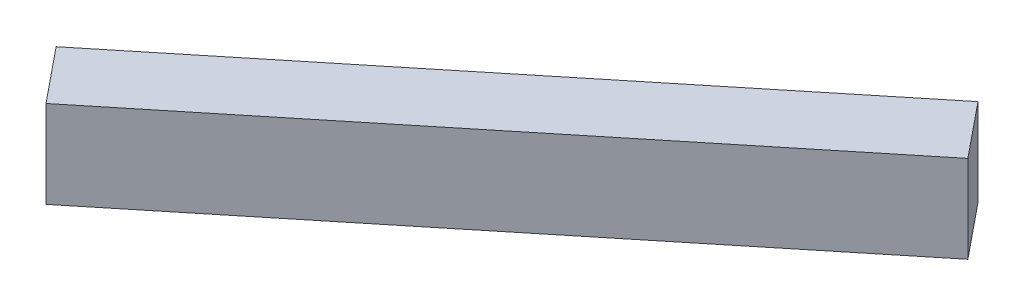
ISO-10303-21;
HEADER;
FILE_DESCRIPTION(('STEP AP214'),'2;1');
FILE_NAME('part.step','',(''),(''),'','','');
FILE_SCHEMA(('AUTOMOTIVE_DESIGN { 1 0 10303 214 1 1 1 1 }'));
ENDSEC;
DATA;
#1=APPLICATION_CONTEXT('core data for automotive mechanical design processes');
#2=APPLICATION_PROTOCOL_DEFINITION('international standard','automotive_design',2000,#1);
#3=PRODUCT_CONTEXT('',#1,'mechanical');
#4=PRODUCT('Part','Part','',(#3));
#5=PRODUCT_RELATED_PRODUCT_CATEGORY('part','',(#4));
#6=PRODUCT_DEFINITION_FORMATION('','',#4);
#7=PRODUCT_DEFINITION_CONTEXT('part definition',#1,'design');
#8=PRODUCT_DEFINITION('design','',#6,#7);
#9=PRODUCT_DEFINITION_SHAPE('','',#8);
#10=(LENGTH_UNIT() NAMED_UNIT(*) SI_UNIT(.MILLI.,.METRE.));
#11=(NAMED_UNIT(*) PLANE_ANGLE_UNIT() SI_UNIT($,.RADIAN.));
#12=(NAMED_UNIT(*) SI_UNIT($,.STERADIAN.) SOLID_ANGLE_UNIT());
#13=UNCERTAINTY_MEASURE_WITH_UNIT(LENGTH_MEASURE(1.E-05),#10,'distance_accuracy_value','');
#14=(GEOMETRIC_REPRESENTATION_CONTEXT(3) GLOBAL_UNCERTAINTY_ASSIGNED_CONTEXT((#13)) GLOBAL_UNIT_ASSIGNED_CONTEXT((#10,
#11,#12)) REPRESENTATION_CONTEXT('',''));
#15=CARTESIAN_POINT('',(0.,0.,0.));
#16=DIRECTION('',(0.,0.,1.));
#17=DIRECTION('',(1.,0.,0.));
#18=AXIS2_PLACEMENT_3D('',#15,#16,#17);
#19=CARTESIAN_POINT('',(-13.9006931284473,7.874,11.4307691939862));
#20=DIRECTION('',(-0.630784157802956,0.,-0.775958340547233));
#21=DIRECTION('',(-0.775958340547233,0.,0.630784157802956));
#22=AXIS2_PLACEMENT_3D('',#19,#20,#21);
#23=PLANE('',#22);
#24=DIRECTION('',(0.,1.,0.));
#25=VECTOR('',#24,1.);
#26=CARTESIAN_POINT('',(-13.9006931284473,7.874,11.4307691939862));
#27=LINE('',#26,#25);
#28=CARTESIAN_POINT('',(-13.9006931284473,7.62,11.4307691939862));
#29=VERTEX_POINT('',#28);
#30=CARTESIAN_POINT('',(-13.9006931284473,7.874,11.4307691939862));
#31=VERTEX_POINT('',#30);
#32=EDGE_CURVE('E20',#29,#31,#27,.T.);
#33=ORIENTED_EDGE('',*,*,#32,.T.);
#34=DIRECTION('',(-0.775958340547245,0.,0.630784157802941));
#35=VECTOR('',#34,1.);
#36=CARTESIAN_POINT('',(-13.9006931284473,7.874,11.4307691939862));
#37=LINE('',#36,#35);
#38=CARTESIAN_POINT('',(-15.3788937671898,7.874,12.6324130146008));
#39=VERTEX_POINT('',#38);
#40=EDGE_CURVE('E55',#31,#39,#37,.T.);
#41=ORIENTED_EDGE('',*,*,#40,.T.);
#42=DIRECTION('',(0.,1.,0.));
#43=VECTOR('',#42,1.);
#44=CARTESIAN_POINT('',(-15.3788937671898,7.874,12.6324130146008));
#45=LINE('',#44,#43);
#46=CARTESIAN_POINT('',(-15.3788937671898,7.62,12.6324130146008));
#47=VERTEX_POINT('',#46);
#48=EDGE_CURVE('E76',#39,#47,#45,.F.);
#49=ORIENTED_EDGE('',*,*,#48,.T.);
#50=DIRECTION('',(-0.775958340547245,0.,0.630784157802941));
#51=VECTOR('',#50,1.);
#52=CARTESIAN_POINT('',(-13.9006931284473,7.62,11.4307691939862));
#53=LINE('',#52,#51);
#54=EDGE_CURVE('E58',#29,#47,#53,.T.);
#55=ORIENTED_EDGE('',*,*,#54,.F.);
#56=EDGE_LOOP('',(#33,#41,#49,#55));
#57=FACE_BOUND('',#56,.T.);
#58=ADVANCED_FACE('F17',(#57),#23,.F.);
#59=CARTESIAN_POINT('',(-13.9006931284473,7.874,11.4307691939862));
#60=DIRECTION('',(-0.775958340547238,0.,0.63078415780295));
#61=DIRECTION('',(0.63078415780295,0.,0.775958340547238));
#62=AXIS2_PLACEMENT_3D('',#59,#60,#61);
#63=PLANE('',#62);
#64=DIRECTION('',(0.,1.,0.));
#65=VECTOR('',#64,1.);
#66=CARTESIAN_POINT('',(-14.0288684693129,7.874,11.273094459187));
#67=LINE('',#66,#65);
#68=CARTESIAN_POINT('',(-14.0288684693129,7.62,11.273094459187));
#69=VERTEX_POINT('',#68);
#70=CARTESIAN_POINT('',(-14.0288684693129,7.874,11.273094459187));
#71=VERTEX_POINT('',#70);
#72=EDGE_CURVE('E73',#69,#71,#67,.T.);
#73=ORIENTED_EDGE('',*,*,#72,.T.);
#74=DIRECTION('',(0.630784157803072,0.,0.775958340547139));
#75=VECTOR('',#74,1.);
#76=CARTESIAN_POINT('',(-14.0288684693129,7.874,11.273094459187));
#77=LINE('',#76,#75);
#78=EDGE_CURVE('E63',#71,#31,#77,.T.);
#79=ORIENTED_EDGE('',*,*,#78,.T.);
#80=ORIENTED_EDGE('',*,*,#32,.F.);
#81=DIRECTION('',(0.630784157803072,0.,0.775958340547139));
#82=VECTOR('',#81,1.);
#83=CARTESIAN_POINT('',(-14.0288684693129,7.62,11.273094459187));
#84=LINE('',#83,#82);
#85=EDGE_CURVE('E80',#69,#29,#84,.T.);
#86=ORIENTED_EDGE('',*,*,#85,.F.);
#87=EDGE_LOOP('',(#73,#79,#80,#86));
#88=FACE_BOUND('',#87,.T.);
#89=ADVANCED_FACE('F72',(#88),#63,.F.);
#90=CARTESIAN_POINT('',(-13.9006931284473,7.874,11.4307691939862));
#91=DIRECTION('',(0.,-1.,0.));
#92=DIRECTION('',(0.,0.,-1.));
#93=AXIS2_PLACEMENT_3D('',#90,#91,#92);
#94=PLANE('',#93);
#95=ORIENTED_EDGE('',*,*,#78,.F.);
#96=DIRECTION('',(0.775958340547232,0.,-0.630784157802957));
#97=VECTOR('',#96,1.);
#98=CARTESIAN_POINT('',(-14.0288684693129,7.874,11.273094459187));
#99=LINE('',#98,#97);
#100=CARTESIAN_POINT('',(-15.5070691082954,7.874,12.4747382799968));
#101=VERTEX_POINT('',#100);
#102=EDGE_CURVE('E83',#71,#101,#99,.F.);
#103=ORIENTED_EDGE('',*,*,#102,.T.);
#104=DIRECTION('',(-0.630784158984234,0.,-0.77595833958696));
#105=VECTOR('',#104,1.);
#106=CARTESIAN_POINT('',(-15.3788937671898,7.874,12.6324130146008));
#107=LINE('',#106,#105);
#108=EDGE_CURVE('E69',#101,#39,#107,.F.);
#109=ORIENTED_EDGE('',*,*,#108,.T.);
#110=ORIENTED_EDGE('',*,*,#40,.F.);
#111=EDGE_LOOP('',(#95,#103,#109,#110));
#112=FACE_BOUND('',#111,.T.);
#113=ADVANCED_FACE('F66',(#112),#94,.F.);
#114=CARTESIAN_POINT('',(-15.3788937671898,7.874,12.6324130146008));
#115=DIRECTION('',(0.77595833958696,0.,-0.630784158984234));
#116=DIRECTION('',(-0.630784158984234,0.,-0.77595833958696));
#117=AXIS2_PLACEMENT_3D('',#114,#115,#116);
#118=PLANE('',#117);
#119=ORIENTED_EDGE('',*,*,#48,.F.);
#120=ORIENTED_EDGE('',*,*,#108,.F.);
#121=DIRECTION('',(0.,1.,0.));
#122=VECTOR('',#121,1.);
#123=CARTESIAN_POINT('',(-15.5070691082954,7.874,12.4747382799968));
#124=LINE('',#123,#122);
#125=CARTESIAN_POINT('',(-15.5070691082954,7.62,12.4747382799968));
#126=VERTEX_POINT('',#125);
#127=EDGE_CURVE('E26',#101,#126,#124,.F.);
#128=ORIENTED_EDGE('',*,*,#127,.T.);
#129=DIRECTION('',(-0.630784158984417,0.,-0.775958339586812));
#130=VECTOR('',#129,1.);
#131=CARTESIAN_POINT('',(-15.3788937671898,7.62,12.6324130146008));
#132=LINE('',#131,#130);
#133=EDGE_CURVE('E34',#47,#126,#132,.T.);
#134=ORIENTED_EDGE('',*,*,#133,.F.);
#135=EDGE_LOOP('',(#119,#120,#128,#134));
#136=FACE_BOUND('',#135,.T.);
#137=ADVANCED_FACE('F88',(#136),#118,.F.);
#138=CARTESIAN_POINT('',(-13.9006931284473,7.62,11.4307691939862));
#139=DIRECTION('',(0.,-1.,0.));
#140=DIRECTION('',(0.,0.,-1.));
#141=AXIS2_PLACEMENT_3D('',#138,#139,#140);
#142=PLANE('',#141);
#143=DIRECTION('',(0.775958340547232,0.,-0.630784157802957));
#144=VECTOR('',#143,1.);
#145=CARTESIAN_POINT('',(-14.0288684693129,7.62,11.273094459187));
#146=LINE('',#145,#144);
#147=EDGE_CURVE('E11',#126,#69,#146,.T.);
#148=ORIENTED_EDGE('',*,*,#147,.T.);
#149=ORIENTED_EDGE('',*,*,#85,.T.);
#150=ORIENTED_EDGE('',*,*,#54,.T.);
#151=ORIENTED_EDGE('',*,*,#133,.T.);
#152=EDGE_LOOP('',(#148,#149,#150,#151));
#153=FACE_BOUND('',#152,.T.);
#154=ADVANCED_FACE('F91',(#153),#142,.T.);
#155=CARTESIAN_POINT('',(-14.0288684693129,7.874,11.273094459187));
#156=DIRECTION('',(0.630784157802957,0.,0.775958340547232));
#157=DIRECTION('',(0.775958340547232,0.,-0.630784157802957));
#158=AXIS2_PLACEMENT_3D('',#155,#156,#157);
#159=PLANE('',#158);
#160=ORIENTED_EDGE('',*,*,#127,.F.);
#161=ORIENTED_EDGE('',*,*,#102,.F.);
#162=ORIENTED_EDGE('',*,*,#72,.F.);
#163=ORIENTED_EDGE('',*,*,#147,.F.);
#164=EDGE_LOOP('',(#160,#161,#162,#163));
#165=FACE_BOUND('',#164,.T.);
#166=ADVANCED_FACE('F90',(#165),#159,.F.);
#167=CLOSED_SHELL('',(#58,#89,#113,#137,#154,#166));
#168=MANIFOLD_SOLID_BREP('B1',#167);
#169=ADVANCED_BREP_SHAPE_REPRESENTATION('',(#18,#168),#14);
#170=SHAPE_DEFINITION_REPRESENTATION(#9,#169);
ENDSEC;
END-ISO-10303-21;
